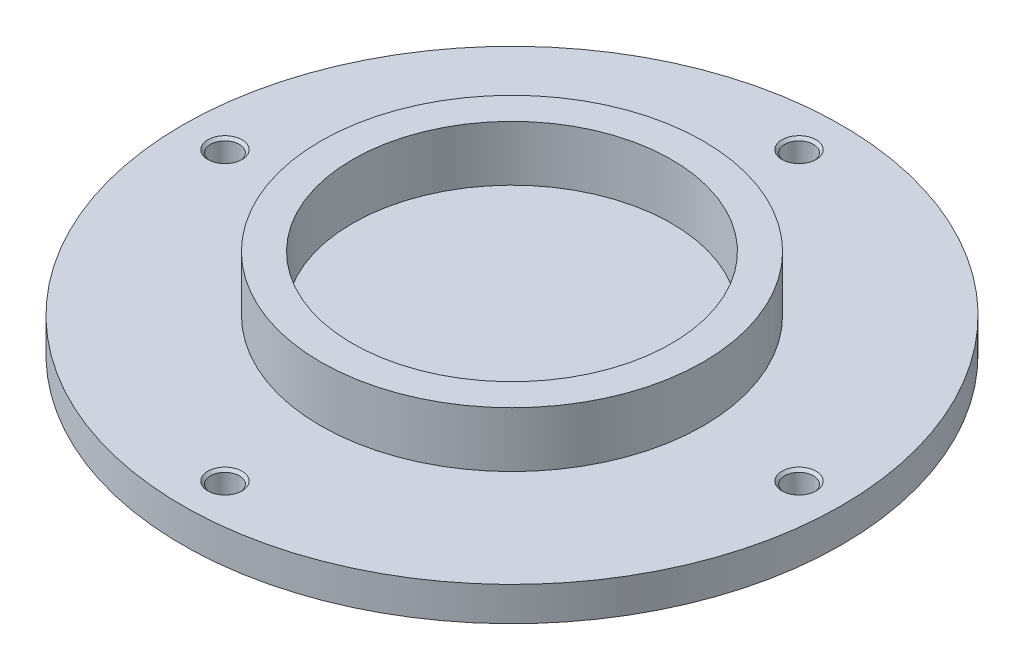
ISO-10303-21;
HEADER;
FILE_DESCRIPTION(('STEP AP214'),'2;1');
FILE_NAME('part.step','',(''),(''),'','','');
FILE_SCHEMA(('AUTOMOTIVE_DESIGN { 1 0 10303 214 1 1 1 1 }'));
ENDSEC;
DATA;
#1=APPLICATION_CONTEXT('core data for automotive mechanical design processes');
#2=APPLICATION_PROTOCOL_DEFINITION('international standard','automotive_design',2000,#1);
#3=PRODUCT_CONTEXT('',#1,'mechanical');
#4=PRODUCT('Part','Part','',(#3));
#5=PRODUCT_RELATED_PRODUCT_CATEGORY('part','',(#4));
#6=PRODUCT_DEFINITION_FORMATION('','',#4);
#7=PRODUCT_DEFINITION_CONTEXT('part definition',#1,'design');
#8=PRODUCT_DEFINITION('design','',#6,#7);
#9=PRODUCT_DEFINITION_SHAPE('','',#8);
#10=(LENGTH_UNIT() NAMED_UNIT(*) SI_UNIT(.MILLI.,.METRE.));
#11=(NAMED_UNIT(*) PLANE_ANGLE_UNIT() SI_UNIT($,.RADIAN.));
#12=(NAMED_UNIT(*) SI_UNIT($,.STERADIAN.) SOLID_ANGLE_UNIT());
#13=UNCERTAINTY_MEASURE_WITH_UNIT(LENGTH_MEASURE(1.E-05),#10,'distance_accuracy_value','');
#14=(GEOMETRIC_REPRESENTATION_CONTEXT(3) GLOBAL_UNCERTAINTY_ASSIGNED_CONTEXT((#13)) GLOBAL_UNIT_ASSIGNED_CONTEXT((#10,
#11,#12)) REPRESENTATION_CONTEXT('',''));
#15=CARTESIAN_POINT('',(0.,0.,0.));
#16=DIRECTION('',(0.,0.,1.));
#17=DIRECTION('',(1.,0.,0.));
#18=AXIS2_PLACEMENT_3D('',#15,#16,#17);
#19=CARTESIAN_POINT('',(0.,0.,0.));
#20=DIRECTION('',(0.,1.,0.));
#21=DIRECTION('',(-1.,0.,0.));
#22=AXIS2_PLACEMENT_3D('',#19,#20,#21);
#23=PLANE('',#22);
#24=CARTESIAN_POINT('',(-67.5,-1.28369537222284E-13,0.));
#25=DIRECTION('',(0.,1.,0.));
#26=DIRECTION('',(0.,0.,1.));
#27=AXIS2_PLACEMENT_3D('',#24,#25,#26);
#28=CIRCLE('',#27,3.4);
#29=CARTESIAN_POINT('',(-67.5,-1.28369537222284E-13,3.4));
#30=VERTEX_POINT('',#29);
#31=EDGE_CURVE('E92',#30,#30,#28,.T.);
#32=ORIENTED_EDGE('',*,*,#31,.T.);
#33=EDGE_LOOP('',(#32));
#34=FACE_BOUND('',#33,.T.);
#35=CARTESIAN_POINT('',(67.5,0.,0.));
#36=DIRECTION('',(0.,1.,0.));
#37=DIRECTION('',(0.,0.,1.));
#38=AXIS2_PLACEMENT_3D('',#35,#36,#37);
#39=CIRCLE('',#38,3.4);
#40=CARTESIAN_POINT('',(67.5,0.,3.4));
#41=VERTEX_POINT('',#40);
#42=EDGE_CURVE('E86',#41,#41,#39,.T.);
#43=ORIENTED_EDGE('',*,*,#42,.T.);
#44=EDGE_LOOP('',(#43));
#45=FACE_BOUND('',#44,.T.);
#46=CARTESIAN_POINT('',(0.,0.,67.5));
#47=DIRECTION('',(0.,1.,0.));
#48=DIRECTION('',(0.,0.,1.));
#49=AXIS2_PLACEMENT_3D('',#46,#47,#48);
#50=CIRCLE('',#49,3.4);
#51=CARTESIAN_POINT('',(0.,0.,70.9));
#52=VERTEX_POINT('',#51);
#53=EDGE_CURVE('E80',#52,#52,#50,.T.);
#54=ORIENTED_EDGE('',*,*,#53,.T.);
#55=EDGE_LOOP('',(#54));
#56=FACE_BOUND('',#55,.T.);
#57=CARTESIAN_POINT('',(0.,0.,-67.5));
#58=DIRECTION('',(0.,1.,0.));
#59=DIRECTION('',(0.,0.,1.));
#60=AXIS2_PLACEMENT_3D('',#57,#58,#59);
#61=CIRCLE('',#60,3.4);
#62=CARTESIAN_POINT('',(0.,0.,-64.1));
#63=VERTEX_POINT('',#62);
#64=EDGE_CURVE('E67',#63,#63,#61,.T.);
#65=ORIENTED_EDGE('',*,*,#64,.T.);
#66=EDGE_LOOP('',(#65));
#67=FACE_BOUND('',#66,.T.);
#68=CARTESIAN_POINT('',(0.,0.,0.));
#69=DIRECTION('',(0.,1.,0.));
#70=DIRECTION('',(-1.,0.,0.));
#71=AXIS2_PLACEMENT_3D('',#68,#69,#70);
#72=CIRCLE('',#71,77.5);
#73=CARTESIAN_POINT('',(-77.5,0.,0.));
#74=VERTEX_POINT('',#73);
#75=EDGE_CURVE('E10',#74,#74,#72,.T.);
#76=ORIENTED_EDGE('',*,*,#75,.F.);
#77=EDGE_LOOP('',(#76));
#78=FACE_BOUND('',#77,.T.);
#79=ADVANCED_FACE('F43',(#34,#45,#56,#67,#78),#23,.F.);
#80=CARTESIAN_POINT('',(0.,8.,0.));
#81=DIRECTION('',(0.,1.,0.));
#82=DIRECTION('',(-1.,0.,0.));
#83=AXIS2_PLACEMENT_3D('',#80,#81,#82);
#84=CYLINDRICAL_SURFACE('',#83,77.5);
#85=CARTESIAN_POINT('',(0.,7.99999999999997,0.));
#86=DIRECTION('',(0.,1.,0.));
#87=DIRECTION('',(-1.,0.,0.));
#88=AXIS2_PLACEMENT_3D('',#85,#86,#87);
#89=CIRCLE('',#88,77.5);
#90=CARTESIAN_POINT('',(-77.5,7.99999999999993,0.));
#91=VERTEX_POINT('',#90);
#92=EDGE_CURVE('E47',#91,#91,#89,.T.);
#93=ORIENTED_EDGE('',*,*,#92,.F.);
#94=EDGE_LOOP('',(#93));
#95=FACE_BOUND('',#94,.T.);
#96=ORIENTED_EDGE('',*,*,#75,.T.);
#97=EDGE_LOOP('',(#96));
#98=FACE_BOUND('',#97,.T.);
#99=ADVANCED_FACE('F111',(#95,#98),#84,.T.);
#100=CARTESIAN_POINT('',(77.5,8.00000000000001,0.));
#101=DIRECTION('',(0.,-1.,0.));
#102=DIRECTION('',(1.,0.,0.));
#103=AXIS2_PLACEMENT_3D('',#100,#101,#102);
#104=PLANE('',#103);
#105=CARTESIAN_POINT('',(-67.5,7.99999999999994,0.));
#106=DIRECTION('',(0.,1.,0.));
#107=DIRECTION('',(0.,0.,1.));
#108=AXIS2_PLACEMENT_3D('',#105,#106,#107);
#109=CIRCLE('',#108,4.025);
#110=CARTESIAN_POINT('',(-67.5,7.99999999999994,4.025));
#111=VERTEX_POINT('',#110);
#112=EDGE_CURVE('E103',#111,#111,#109,.T.);
#113=ORIENTED_EDGE('',*,*,#112,.F.);
#114=EDGE_LOOP('',(#113));
#115=FACE_BOUND('',#114,.T.);
#116=CARTESIAN_POINT('',(67.5,8.,0.));
#117=DIRECTION('',(0.,1.,0.));
#118=DIRECTION('',(0.,0.,1.));
#119=AXIS2_PLACEMENT_3D('',#116,#117,#118);
#120=CIRCLE('',#119,4.025);
#121=CARTESIAN_POINT('',(67.5,8.,4.025));
#122=VERTEX_POINT('',#121);
#123=EDGE_CURVE('E95',#122,#122,#120,.T.);
#124=ORIENTED_EDGE('',*,*,#123,.F.);
#125=EDGE_LOOP('',(#124));
#126=FACE_BOUND('',#125,.T.);
#127=CARTESIAN_POINT('',(0.,7.99999999999997,67.5));
#128=DIRECTION('',(0.,1.,0.));
#129=DIRECTION('',(0.,0.,1.));
#130=AXIS2_PLACEMENT_3D('',#127,#128,#129);
#131=CIRCLE('',#130,4.025);
#132=CARTESIAN_POINT('',(0.,7.99999999999997,71.525));
#133=VERTEX_POINT('',#132);
#134=EDGE_CURVE('E84',#133,#133,#131,.T.);
#135=ORIENTED_EDGE('',*,*,#134,.F.);
#136=EDGE_LOOP('',(#135));
#137=FACE_BOUND('',#136,.T.);
#138=CARTESIAN_POINT('',(0.,7.99999999999997,-67.5));
#139=DIRECTION('',(0.,1.,0.));
#140=DIRECTION('',(0.,0.,1.));
#141=AXIS2_PLACEMENT_3D('',#138,#139,#140);
#142=CIRCLE('',#141,4.025);
#143=CARTESIAN_POINT('',(0.,7.99999999999997,-63.475));
#144=VERTEX_POINT('',#143);
#145=EDGE_CURVE('E74',#144,#144,#142,.T.);
#146=ORIENTED_EDGE('',*,*,#145,.F.);
#147=EDGE_LOOP('',(#146));
#148=FACE_BOUND('',#147,.T.);
#149=CARTESIAN_POINT('',(0.,7.99999999999998,0.));
#150=DIRECTION('',(0.,1.,0.));
#151=DIRECTION('',(-1.,0.,0.));
#152=AXIS2_PLACEMENT_3D('',#149,#150,#151);
#153=CIRCLE('',#152,45.);
#154=CARTESIAN_POINT('',(-45.,7.99999999999996,0.));
#155=VERTEX_POINT('',#154);
#156=EDGE_CURVE('E52',#155,#155,#153,.T.);
#157=ORIENTED_EDGE('',*,*,#156,.F.);
#158=EDGE_LOOP('',(#157));
#159=FACE_BOUND('',#158,.T.);
#160=ORIENTED_EDGE('',*,*,#92,.T.);
#161=EDGE_LOOP('',(#160));
#162=FACE_BOUND('',#161,.T.);
#163=ADVANCED_FACE('F110',(#115,#126,#137,#148,#159,#162),#104,.F.);
#164=CARTESIAN_POINT('',(0.,8.,0.));
#165=DIRECTION('',(0.,1.,0.));
#166=DIRECTION('',(-1.,0.,0.));
#167=AXIS2_PLACEMENT_3D('',#164,#165,#166);
#168=CYLINDRICAL_SURFACE('',#167,45.);
#169=CARTESIAN_POINT('',(0.,21.,0.));
#170=DIRECTION('',(0.,1.,0.));
#171=DIRECTION('',(-1.,0.,0.));
#172=AXIS2_PLACEMENT_3D('',#169,#170,#171);
#173=CIRCLE('',#172,45.);
#174=CARTESIAN_POINT('',(-45.,21.,0.));
#175=VERTEX_POINT('',#174);
#176=EDGE_CURVE('E60',#175,#175,#173,.T.);
#177=ORIENTED_EDGE('',*,*,#176,.F.);
#178=EDGE_LOOP('',(#177));
#179=FACE_BOUND('',#178,.T.);
#180=ORIENTED_EDGE('',*,*,#156,.T.);
#181=EDGE_LOOP('',(#180));
#182=FACE_BOUND('',#181,.T.);
#183=ADVANCED_FACE('F109',(#179,#182),#168,.T.);
#184=CARTESIAN_POINT('',(45.,21.,0.));
#185=DIRECTION('',(0.,-1.,0.));
#186=DIRECTION('',(1.,0.,0.));
#187=AXIS2_PLACEMENT_3D('',#184,#185,#186);
#188=PLANE('',#187);
#189=CARTESIAN_POINT('',(0.,21.,0.));
#190=DIRECTION('',(0.,1.,0.));
#191=DIRECTION('',(-1.,0.,0.));
#192=AXIS2_PLACEMENT_3D('',#189,#190,#191);
#193=CIRCLE('',#192,37.5);
#194=CARTESIAN_POINT('',(-37.5,21.,0.));
#195=VERTEX_POINT('',#194);
#196=EDGE_CURVE('E65',#195,#195,#193,.T.);
#197=ORIENTED_EDGE('',*,*,#196,.F.);
#198=EDGE_LOOP('',(#197));
#199=FACE_BOUND('',#198,.T.);
#200=ORIENTED_EDGE('',*,*,#176,.T.);
#201=EDGE_LOOP('',(#200));
#202=FACE_BOUND('',#201,.T.);
#203=ADVANCED_FACE('F125',(#199,#202),#188,.F.);
#204=CARTESIAN_POINT('',(0.,8.,0.));
#205=DIRECTION('',(0.,1.,0.));
#206=DIRECTION('',(-1.,0.,0.));
#207=AXIS2_PLACEMENT_3D('',#204,#205,#206);
#208=CYLINDRICAL_SURFACE('',#207,37.5);
#209=CARTESIAN_POINT('',(0.,7.99999999999999,0.));
#210=DIRECTION('',(0.,1.,0.));
#211=DIRECTION('',(-1.,0.,0.));
#212=AXIS2_PLACEMENT_3D('',#209,#210,#211);
#213=CIRCLE('',#212,37.5);
#214=CARTESIAN_POINT('',(-37.5,7.99999999999997,0.));
#215=VERTEX_POINT('',#214);
#216=EDGE_CURVE('E63',#215,#215,#213,.T.);
#217=ORIENTED_EDGE('',*,*,#216,.F.);
#218=EDGE_LOOP('',(#217));
#219=FACE_BOUND('',#218,.T.);
#220=ORIENTED_EDGE('',*,*,#196,.T.);
#221=EDGE_LOOP('',(#220));
#222=FACE_BOUND('',#221,.T.);
#223=ADVANCED_FACE('F126',(#219,#222),#208,.F.);
#224=CARTESIAN_POINT('',(37.5,8.00000000000001,0.));
#225=DIRECTION('',(0.,-1.,0.));
#226=DIRECTION('',(1.,0.,0.));
#227=AXIS2_PLACEMENT_3D('',#224,#225,#226);
#228=PLANE('',#227);
#229=ORIENTED_EDGE('',*,*,#216,.T.);
#230=EDGE_LOOP('',(#229));
#231=FACE_BOUND('',#230,.T.);
#232=ADVANCED_FACE('F155',(#231),#228,.F.);
#233=CARTESIAN_POINT('',(0.,7.99999999999997,-67.5));
#234=DIRECTION('',(0.,1.,0.));
#235=DIRECTION('',(0.,0.,1.));
#236=AXIS2_PLACEMENT_3D('',#233,#234,#235);
#237=CYLINDRICAL_SURFACE('',#236,3.4);
#238=ORIENTED_EDGE('',*,*,#64,.F.);
#239=EDGE_LOOP('',(#238));
#240=FACE_BOUND('',#239,.T.);
#241=CARTESIAN_POINT('',(0.,7.37499999999997,-67.5));
#242=DIRECTION('',(0.,1.,0.));
#243=DIRECTION('',(0.,0.,1.));
#244=AXIS2_PLACEMENT_3D('',#241,#242,#243);
#245=CIRCLE('',#244,3.4);
#246=CARTESIAN_POINT('',(0.,7.37499999999997,-64.1));
#247=VERTEX_POINT('',#246);
#248=EDGE_CURVE('E73',#247,#247,#245,.T.);
#249=ORIENTED_EDGE('',*,*,#248,.T.);
#250=EDGE_LOOP('',(#249));
#251=FACE_BOUND('',#250,.T.);
#252=ADVANCED_FACE('F149',(#240,#251),#237,.F.);
#253=CARTESIAN_POINT('',(0.,7.99999999999997,-67.5));
#254=DIRECTION('',(0.,1.,0.));
#255=DIRECTION('',(0.,0.,1.));
#256=AXIS2_PLACEMENT_3D('',#253,#254,#255);
#257=CONICAL_SURFACE('',#256,4.025,0.785398163397447);
#258=ORIENTED_EDGE('',*,*,#248,.F.);
#259=EDGE_LOOP('',(#258));
#260=FACE_BOUND('',#259,.T.);
#261=ORIENTED_EDGE('',*,*,#145,.T.);
#262=EDGE_LOOP('',(#261));
#263=FACE_BOUND('',#262,.T.);
#264=ADVANCED_FACE('F151',(#260,#263),#257,.F.);
#265=CARTESIAN_POINT('',(0.,7.99999999999997,67.5));
#266=DIRECTION('',(0.,1.,0.));
#267=DIRECTION('',(0.,0.,1.));
#268=AXIS2_PLACEMENT_3D('',#265,#266,#267);
#269=CYLINDRICAL_SURFACE('',#268,3.4);
#270=ORIENTED_EDGE('',*,*,#53,.F.);
#271=EDGE_LOOP('',(#270));
#272=FACE_BOUND('',#271,.T.);
#273=CARTESIAN_POINT('',(0.,7.37499999999997,67.5));
#274=DIRECTION('',(0.,1.,0.));
#275=DIRECTION('',(0.,0.,1.));
#276=AXIS2_PLACEMENT_3D('',#273,#274,#275);
#277=CIRCLE('',#276,3.4);
#278=CARTESIAN_POINT('',(0.,7.37499999999997,70.9));
#279=VERTEX_POINT('',#278);
#280=EDGE_CURVE('E78',#279,#279,#277,.T.);
#281=ORIENTED_EDGE('',*,*,#280,.T.);
#282=EDGE_LOOP('',(#281));
#283=FACE_BOUND('',#282,.T.);
#284=ADVANCED_FACE('F156',(#272,#283),#269,.F.);
#285=CARTESIAN_POINT('',(0.,7.99999999999997,67.5));
#286=DIRECTION('',(0.,1.,0.));
#287=DIRECTION('',(0.,0.,1.));
#288=AXIS2_PLACEMENT_3D('',#285,#286,#287);
#289=CONICAL_SURFACE('',#288,4.025,0.785398163397447);
#290=ORIENTED_EDGE('',*,*,#280,.F.);
#291=EDGE_LOOP('',(#290));
#292=FACE_BOUND('',#291,.T.);
#293=ORIENTED_EDGE('',*,*,#134,.T.);
#294=EDGE_LOOP('',(#293));
#295=FACE_BOUND('',#294,.T.);
#296=ADVANCED_FACE('F164',(#292,#295),#289,.F.);
#297=CARTESIAN_POINT('',(67.5,8.,0.));
#298=DIRECTION('',(0.,1.,0.));
#299=DIRECTION('',(0.,0.,1.));
#300=AXIS2_PLACEMENT_3D('',#297,#298,#299);
#301=CYLINDRICAL_SURFACE('',#300,3.4);
#302=ORIENTED_EDGE('',*,*,#42,.F.);
#303=EDGE_LOOP('',(#302));
#304=FACE_BOUND('',#303,.T.);
#305=CARTESIAN_POINT('',(67.5,7.375,0.));
#306=DIRECTION('',(0.,1.,0.));
#307=DIRECTION('',(0.,0.,1.));
#308=AXIS2_PLACEMENT_3D('',#305,#306,#307);
#309=CIRCLE('',#308,3.4);
#310=CARTESIAN_POINT('',(67.5,7.375,3.4));
#311=VERTEX_POINT('',#310);
#312=EDGE_CURVE('E88',#311,#311,#309,.T.);
#313=ORIENTED_EDGE('',*,*,#312,.T.);
#314=EDGE_LOOP('',(#313));
#315=FACE_BOUND('',#314,.T.);
#316=ADVANCED_FACE('F214',(#304,#315),#301,.F.);
#317=CARTESIAN_POINT('',(67.5,8.,0.));
#318=DIRECTION('',(0.,1.,0.));
#319=DIRECTION('',(0.,0.,1.));
#320=AXIS2_PLACEMENT_3D('',#317,#318,#319);
#321=CONICAL_SURFACE('',#320,4.025,0.785398163397446);
#322=ORIENTED_EDGE('',*,*,#312,.F.);
#323=EDGE_LOOP('',(#322));
#324=FACE_BOUND('',#323,.T.);
#325=ORIENTED_EDGE('',*,*,#123,.T.);
#326=EDGE_LOOP('',(#325));
#327=FACE_BOUND('',#326,.T.);
#328=ADVANCED_FACE('F221',(#324,#327),#321,.F.);
#329=CARTESIAN_POINT('',(-67.5,7.99999999999994,0.));
#330=DIRECTION('',(0.,1.,0.));
#331=DIRECTION('',(0.,0.,1.));
#332=AXIS2_PLACEMENT_3D('',#329,#330,#331);
#333=CYLINDRICAL_SURFACE('',#332,3.4);
#334=ORIENTED_EDGE('',*,*,#31,.F.);
#335=EDGE_LOOP('',(#334));
#336=FACE_BOUND('',#335,.T.);
#337=CARTESIAN_POINT('',(-67.5,7.37499999999994,0.));
#338=DIRECTION('',(0.,1.,0.));
#339=DIRECTION('',(0.,0.,1.));
#340=AXIS2_PLACEMENT_3D('',#337,#338,#339);
#341=CIRCLE('',#340,3.4);
#342=CARTESIAN_POINT('',(-67.5,7.37499999999994,3.4));
#343=VERTEX_POINT('',#342);
#344=EDGE_CURVE('E96',#343,#343,#341,.T.);
#345=ORIENTED_EDGE('',*,*,#344,.T.);
#346=EDGE_LOOP('',(#345));
#347=FACE_BOUND('',#346,.T.);
#348=ADVANCED_FACE('F231',(#336,#347),#333,.F.);
#349=CARTESIAN_POINT('',(-67.5,7.99999999999994,0.));
#350=DIRECTION('',(0.,1.,0.));
#351=DIRECTION('',(0.,0.,1.));
#352=AXIS2_PLACEMENT_3D('',#349,#350,#351);
#353=CONICAL_SURFACE('',#352,4.025,0.785398163397446);
#354=ORIENTED_EDGE('',*,*,#344,.F.);
#355=EDGE_LOOP('',(#354));
#356=FACE_BOUND('',#355,.T.);
#357=ORIENTED_EDGE('',*,*,#112,.T.);
#358=EDGE_LOOP('',(#357));
#359=FACE_BOUND('',#358,.T.);
#360=ADVANCED_FACE('F102',(#356,#359),#353,.F.);
#361=CLOSED_SHELL('',(#79,#99,#163,#183,#203,#223,#232,#252,#264,#284,#296,#316,#328,#348,#360));
#362=MANIFOLD_SOLID_BREP('B2',#361);
#363=ADVANCED_BREP_SHAPE_REPRESENTATION('',(#18,#362),#14);
#364=SHAPE_DEFINITION_REPRESENTATION(#9,#363);
ENDSEC;
END-ISO-10303-21;
